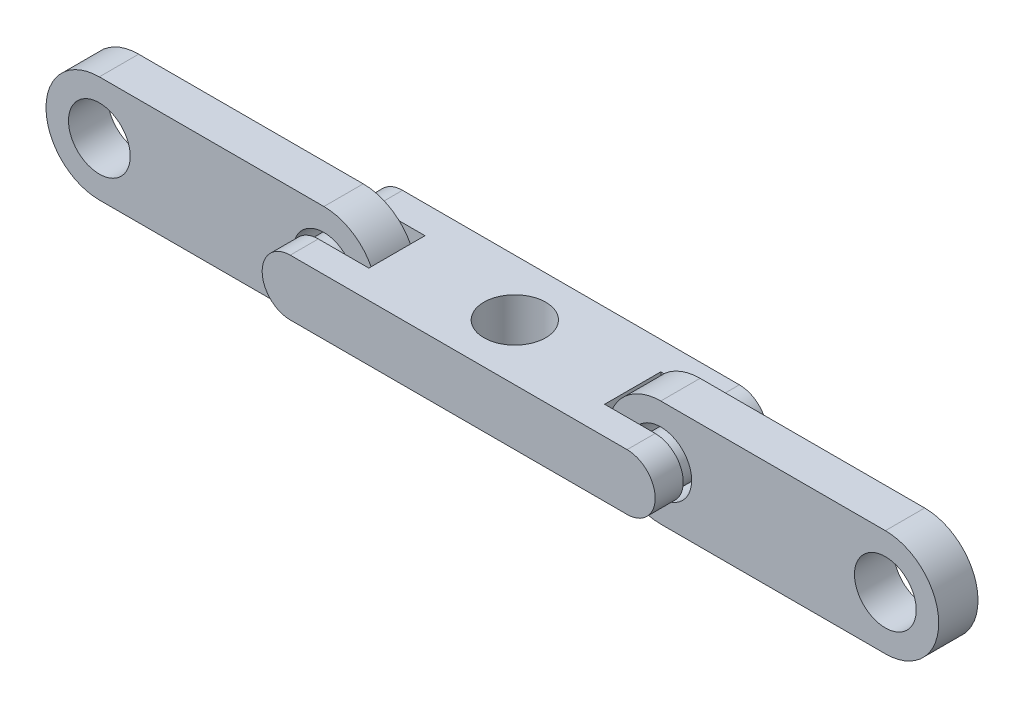
ISO-10303-21;
HEADER;
FILE_DESCRIPTION(('STEP AP214'),'2;1');
FILE_NAME('part.step','',(''),(''),'','','');
FILE_SCHEMA(('AUTOMOTIVE_DESIGN { 1 0 10303 214 1 1 1 1 }'));
ENDSEC;
DATA;
#1=APPLICATION_CONTEXT('core data for automotive mechanical design processes');
#2=APPLICATION_PROTOCOL_DEFINITION('international standard','automotive_design',2000,#1);
#3=PRODUCT_CONTEXT('',#1,'mechanical');
#4=PRODUCT('Part','Part','',(#3));
#5=PRODUCT_RELATED_PRODUCT_CATEGORY('part','',(#4));
#6=PRODUCT_DEFINITION_FORMATION('','',#4);
#7=PRODUCT_DEFINITION_CONTEXT('part definition',#1,'design');
#8=PRODUCT_DEFINITION('design','',#6,#7);
#9=PRODUCT_DEFINITION_SHAPE('','',#8);
#10=(LENGTH_UNIT() NAMED_UNIT(*) SI_UNIT(.MILLI.,.METRE.));
#11=(NAMED_UNIT(*) PLANE_ANGLE_UNIT() SI_UNIT($,.RADIAN.));
#12=(NAMED_UNIT(*) SI_UNIT($,.STERADIAN.) SOLID_ANGLE_UNIT());
#13=UNCERTAINTY_MEASURE_WITH_UNIT(LENGTH_MEASURE(1.E-05),#10,'distance_accuracy_value','');
#14=(GEOMETRIC_REPRESENTATION_CONTEXT(3) GLOBAL_UNCERTAINTY_ASSIGNED_CONTEXT((#13)) GLOBAL_UNIT_ASSIGNED_CONTEXT((#10,
#11,#12)) REPRESENTATION_CONTEXT('',''));
#15=CARTESIAN_POINT('',(0.,0.,0.));
#16=DIRECTION('',(0.,0.,1.));
#17=DIRECTION('',(1.,0.,0.));
#18=AXIS2_PLACEMENT_3D('',#15,#16,#17);
#19=CARTESIAN_POINT('',(15.,0.,5.));
#20=DIRECTION('',(0.,0.,-1.));
#21=DIRECTION('',(-1.,0.,0.));
#22=AXIS2_PLACEMENT_3D('',#19,#20,#21);
#23=CYLINDRICAL_SURFACE('',#22,2.5);
#24=DIRECTION('',(0.,0.,1.));
#25=VECTOR('',#24,1.);
#26=CARTESIAN_POINT('',(15.,2.5,5.));
#27=LINE('',#26,#25);
#28=CARTESIAN_POINT('',(15.,2.5,5.));
#29=VERTEX_POINT('',#28);
#30=CARTESIAN_POINT('',(15.,2.5,2.5));
#31=VERTEX_POINT('',#30);
#32=EDGE_CURVE('P0_E111',#29,#31,#27,.F.);
#33=ORIENTED_EDGE('',*,*,#32,.F.);
#34=CARTESIAN_POINT('',(15.,0.,5.));
#35=DIRECTION('',(0.,0.,-1.));
#36=DIRECTION('',(-1.,0.,0.));
#37=AXIS2_PLACEMENT_3D('',#34,#35,#36);
#38=CIRCLE('',#37,2.5);
#39=CARTESIAN_POINT('',(15.,-2.5,5.));
#40=VERTEX_POINT('',#39);
#41=EDGE_CURVE('P0_E25',#40,#29,#38,.F.);
#42=ORIENTED_EDGE('',*,*,#41,.F.);
#43=DIRECTION('',(0.,0.,-1.));
#44=VECTOR('',#43,1.);
#45=CARTESIAN_POINT('',(15.,-2.5,0.));
#46=LINE('',#45,#44);
#47=CARTESIAN_POINT('',(15.,-2.5,2.5));
#48=VERTEX_POINT('',#47);
#49=EDGE_CURVE('P0_E205',#48,#40,#46,.F.);
#50=ORIENTED_EDGE('',*,*,#49,.F.);
#51=CARTESIAN_POINT('',(15.,0.,2.5));
#52=DIRECTION('',(0.,0.,1.));
#53=DIRECTION('',(1.,0.,0.));
#54=AXIS2_PLACEMENT_3D('',#51,#52,#53);
#55=CIRCLE('',#54,2.5);
#56=EDGE_CURVE('P0_E11',#31,#48,#55,.F.);
#57=ORIENTED_EDGE('',*,*,#56,.F.);
#58=EDGE_LOOP('',(#33,#42,#50,#57));
#59=FACE_BOUND('',#58,.T.);
#60=ADVANCED_FACE('P0_F17',(#59),#23,.T.);
#61=CARTESIAN_POINT('',(15.,0.,-2.5));
#62=DIRECTION('',(0.,0.,-1.));
#63=DIRECTION('',(-1.,0.,0.));
#64=AXIS2_PLACEMENT_3D('',#61,#62,#63);
#65=CYLINDRICAL_SURFACE('',#64,2.5);
#66=DIRECTION('',(0.,0.,1.));
#67=VECTOR('',#66,1.);
#68=CARTESIAN_POINT('',(15.,2.5,-2.5));
#69=LINE('',#68,#67);
#70=CARTESIAN_POINT('',(15.,2.5,-2.5));
#71=VERTEX_POINT('',#70);
#72=CARTESIAN_POINT('',(15.,2.5,-5.));
#73=VERTEX_POINT('',#72);
#74=EDGE_CURVE('P0_E194',#71,#73,#69,.F.);
#75=ORIENTED_EDGE('',*,*,#74,.F.);
#76=CARTESIAN_POINT('',(15.,0.,-2.5));
#77=DIRECTION('',(0.,0.,-1.));
#78=DIRECTION('',(-1.,0.,0.));
#79=AXIS2_PLACEMENT_3D('',#76,#77,#78);
#80=CIRCLE('',#79,2.5);
#81=CARTESIAN_POINT('',(15.,-2.5,-2.5));
#82=VERTEX_POINT('',#81);
#83=EDGE_CURVE('P0_E200',#82,#71,#80,.F.);
#84=ORIENTED_EDGE('',*,*,#83,.F.);
#85=DIRECTION('',(0.,0.,-1.));
#86=VECTOR('',#85,1.);
#87=CARTESIAN_POINT('',(15.,-2.5,0.));
#88=LINE('',#87,#86);
#89=CARTESIAN_POINT('',(15.,-2.5,-5.));
#90=VERTEX_POINT('',#89);
#91=EDGE_CURVE('P0_E197',#90,#82,#88,.F.);
#92=ORIENTED_EDGE('',*,*,#91,.F.);
#93=CARTESIAN_POINT('',(15.,0.,-5.));
#94=DIRECTION('',(0.,0.,1.));
#95=DIRECTION('',(1.,0.,0.));
#96=AXIS2_PLACEMENT_3D('',#93,#94,#95);
#97=CIRCLE('',#96,2.5);
#98=EDGE_CURVE('P0_E202',#73,#90,#97,.F.);
#99=ORIENTED_EDGE('',*,*,#98,.F.);
#100=EDGE_LOOP('',(#75,#84,#92,#99));
#101=FACE_BOUND('',#100,.T.);
#102=ADVANCED_FACE('P0_F246',(#101),#65,.T.);
#103=CARTESIAN_POINT('',(-15.,0.,-5.));
#104=DIRECTION('',(0.,0.,1.));
#105=DIRECTION('',(1.,0.,0.));
#106=AXIS2_PLACEMENT_3D('',#103,#104,#105);
#107=CYLINDRICAL_SURFACE('',#106,2.5);
#108=DIRECTION('',(0.,0.,-1.));
#109=VECTOR('',#108,1.);
#110=CARTESIAN_POINT('',(-15.,2.5,-5.));
#111=LINE('',#110,#109);
#112=CARTESIAN_POINT('',(-15.,2.5,-5.));
#113=VERTEX_POINT('',#112);
#114=CARTESIAN_POINT('',(-15.,2.5,-2.5));
#115=VERTEX_POINT('',#114);
#116=EDGE_CURVE('P0_E183',#113,#115,#111,.F.);
#117=ORIENTED_EDGE('',*,*,#116,.F.);
#118=CARTESIAN_POINT('',(-15.,0.,-5.));
#119=DIRECTION('',(0.,0.,1.));
#120=DIRECTION('',(1.,0.,0.));
#121=AXIS2_PLACEMENT_3D('',#118,#119,#120);
#122=CIRCLE('',#121,2.5);
#123=CARTESIAN_POINT('',(-15.,-2.5,-5.));
#124=VERTEX_POINT('',#123);
#125=EDGE_CURVE('P0_E189',#124,#113,#122,.F.);
#126=ORIENTED_EDGE('',*,*,#125,.F.);
#127=DIRECTION('',(0.,0.,1.));
#128=VECTOR('',#127,1.);
#129=CARTESIAN_POINT('',(-15.,-2.5,0.));
#130=LINE('',#129,#128);
#131=CARTESIAN_POINT('',(-15.,-2.5,-2.5));
#132=VERTEX_POINT('',#131);
#133=EDGE_CURVE('P0_E186',#132,#124,#130,.F.);
#134=ORIENTED_EDGE('',*,*,#133,.F.);
#135=CARTESIAN_POINT('',(-15.,0.,-2.5));
#136=DIRECTION('',(0.,0.,-1.));
#137=DIRECTION('',(-1.,0.,0.));
#138=AXIS2_PLACEMENT_3D('',#135,#136,#137);
#139=CIRCLE('',#138,2.5);
#140=EDGE_CURVE('P0_E192',#115,#132,#139,.F.);
#141=ORIENTED_EDGE('',*,*,#140,.F.);
#142=EDGE_LOOP('',(#117,#126,#134,#141));
#143=FACE_BOUND('',#142,.T.);
#144=ADVANCED_FACE('P0_F233',(#143),#107,.T.);
#145=CARTESIAN_POINT('',(-15.,0.,2.5));
#146=DIRECTION('',(0.,0.,1.));
#147=DIRECTION('',(1.,0.,0.));
#148=AXIS2_PLACEMENT_3D('',#145,#146,#147);
#149=CYLINDRICAL_SURFACE('',#148,2.5);
#150=DIRECTION('',(0.,0.,-1.));
#151=VECTOR('',#150,1.);
#152=CARTESIAN_POINT('',(-15.,2.5,2.5));
#153=LINE('',#152,#151);
#154=CARTESIAN_POINT('',(-15.,2.5,2.5));
#155=VERTEX_POINT('',#154);
#156=CARTESIAN_POINT('',(-15.,2.5,5.));
#157=VERTEX_POINT('',#156);
#158=EDGE_CURVE('P0_E173',#155,#157,#153,.F.);
#159=ORIENTED_EDGE('',*,*,#158,.F.);
#160=CARTESIAN_POINT('',(-15.,0.,2.5));
#161=DIRECTION('',(0.,0.,1.));
#162=DIRECTION('',(1.,0.,0.));
#163=AXIS2_PLACEMENT_3D('',#160,#161,#162);
#164=CIRCLE('',#163,2.5);
#165=CARTESIAN_POINT('',(-15.,-2.5,2.5));
#166=VERTEX_POINT('',#165);
#167=EDGE_CURVE('P0_E179',#166,#155,#164,.F.);
#168=ORIENTED_EDGE('',*,*,#167,.F.);
#169=DIRECTION('',(0.,0.,1.));
#170=VECTOR('',#169,1.);
#171=CARTESIAN_POINT('',(-15.,-2.5,0.));
#172=LINE('',#171,#170);
#173=CARTESIAN_POINT('',(-15.,-2.5,5.));
#174=VERTEX_POINT('',#173);
#175=EDGE_CURVE('P0_E176',#174,#166,#172,.F.);
#176=ORIENTED_EDGE('',*,*,#175,.F.);
#177=CARTESIAN_POINT('',(-15.,0.,5.));
#178=DIRECTION('',(0.,0.,-1.));
#179=DIRECTION('',(-1.,0.,0.));
#180=AXIS2_PLACEMENT_3D('',#177,#178,#179);
#181=CIRCLE('',#180,2.5);
#182=EDGE_CURVE('P0_E181',#157,#174,#181,.F.);
#183=ORIENTED_EDGE('',*,*,#182,.F.);
#184=EDGE_LOOP('',(#159,#168,#176,#183));
#185=FACE_BOUND('',#184,.T.);
#186=ADVANCED_FACE('P0_F213',(#185),#149,.T.);
#187=CARTESIAN_POINT('',(0.,2.5,0.));
#188=DIRECTION('',(0.,1.,0.));
#189=DIRECTION('',(0.,0.,1.));
#190=AXIS2_PLACEMENT_3D('',#187,#188,#189);
#191=PLANE('',#190);
#192=DIRECTION('',(1.,0.,0.));
#193=VECTOR('',#192,1.);
#194=CARTESIAN_POINT('',(-17.5,2.5,5.));
#195=LINE('',#194,#193);
#196=EDGE_CURVE('P0_E141',#157,#29,#195,.T.);
#197=ORIENTED_EDGE('',*,*,#196,.T.);
#198=ORIENTED_EDGE('',*,*,#32,.T.);
#199=DIRECTION('',(-1.,0.,0.));
#200=VECTOR('',#199,1.);
#201=CARTESIAN_POINT('',(10.5,2.5,2.5));
#202=LINE('',#201,#200);
#203=CARTESIAN_POINT('',(10.5,2.5,2.5));
#204=VERTEX_POINT('',#203);
#205=EDGE_CURVE('P0_E102',#31,#204,#202,.T.);
#206=ORIENTED_EDGE('',*,*,#205,.T.);
#207=DIRECTION('',(0.,0.,-1.));
#208=VECTOR('',#207,1.);
#209=CARTESIAN_POINT('',(10.5,2.5,-2.5));
#210=LINE('',#209,#208);
#211=CARTESIAN_POINT('',(10.5,2.5,-2.5));
#212=VERTEX_POINT('',#211);
#213=EDGE_CURVE('P0_E109',#204,#212,#210,.T.);
#214=ORIENTED_EDGE('',*,*,#213,.T.);
#215=DIRECTION('',(1.,0.,0.));
#216=VECTOR('',#215,1.);
#217=CARTESIAN_POINT('',(17.5,2.5,-2.5));
#218=LINE('',#217,#216);
#219=EDGE_CURVE('P0_E127',#212,#71,#218,.T.);
#220=ORIENTED_EDGE('',*,*,#219,.T.);
#221=ORIENTED_EDGE('',*,*,#74,.T.);
#222=DIRECTION('',(-1.,0.,0.));
#223=VECTOR('',#222,1.);
#224=CARTESIAN_POINT('',(-17.5,2.5,-5.));
#225=LINE('',#224,#223);
#226=EDGE_CURVE('P0_E129',#73,#113,#225,.T.);
#227=ORIENTED_EDGE('',*,*,#226,.T.);
#228=ORIENTED_EDGE('',*,*,#116,.T.);
#229=DIRECTION('',(1.,0.,0.));
#230=VECTOR('',#229,1.);
#231=CARTESIAN_POINT('',(-17.5,2.5,-2.5));
#232=LINE('',#231,#230);
#233=CARTESIAN_POINT('',(-10.5,2.5,-2.5));
#234=VERTEX_POINT('',#233);
#235=EDGE_CURVE('P0_E134',#115,#234,#232,.T.);
#236=ORIENTED_EDGE('',*,*,#235,.T.);
#237=DIRECTION('',(0.,0.,1.));
#238=VECTOR('',#237,1.);
#239=CARTESIAN_POINT('',(-10.5,2.5,-2.5));
#240=LINE('',#239,#238);
#241=CARTESIAN_POINT('',(-10.5,2.5,2.5));
#242=VERTEX_POINT('',#241);
#243=EDGE_CURVE('P0_E136',#234,#242,#240,.T.);
#244=ORIENTED_EDGE('',*,*,#243,.T.);
#245=DIRECTION('',(-1.,0.,0.));
#246=VECTOR('',#245,1.);
#247=CARTESIAN_POINT('',(-10.5,2.5,2.5));
#248=LINE('',#247,#246);
#249=EDGE_CURVE('P0_E138',#242,#155,#248,.T.);
#250=ORIENTED_EDGE('',*,*,#249,.T.);
#251=ORIENTED_EDGE('',*,*,#158,.T.);
#252=EDGE_LOOP('',(#197,#198,#206,#214,#220,#221,#227,#228,#236,#244,#250,#251));
#253=FACE_BOUND('',#252,.T.);
#254=CARTESIAN_POINT('',(0.,2.5,0.));
#255=DIRECTION('',(0.,1.,0.));
#256=DIRECTION('',(0.,0.,1.));
#257=AXIS2_PLACEMENT_3D('',#254,#255,#256);
#258=CIRCLE('',#257,2.75);
#259=CARTESIAN_POINT('',(0.,2.5,2.75));
#260=VERTEX_POINT('',#259);
#261=EDGE_CURVE('P0_E146',#260,#260,#258,.T.);
#262=ORIENTED_EDGE('',*,*,#261,.F.);
#263=EDGE_LOOP('',(#262));
#264=FACE_BOUND('',#263,.T.);
#265=ADVANCED_FACE('P0_F105',(#253,#264),#191,.T.);
#266=CARTESIAN_POINT('',(0.,-2.5,0.));
#267=DIRECTION('',(0.,1.,0.));
#268=DIRECTION('',(0.,0.,1.));
#269=AXIS2_PLACEMENT_3D('',#266,#267,#268);
#270=PLANE('',#269);
#271=DIRECTION('',(-1.,0.,0.));
#272=VECTOR('',#271,1.);
#273=CARTESIAN_POINT('',(10.5,-2.5,2.5));
#274=LINE('',#273,#272);
#275=CARTESIAN_POINT('',(10.5,-2.5,2.5));
#276=VERTEX_POINT('',#275);
#277=EDGE_CURVE('P0_E118',#48,#276,#274,.T.);
#278=ORIENTED_EDGE('',*,*,#277,.F.);
#279=ORIENTED_EDGE('',*,*,#49,.T.);
#280=DIRECTION('',(1.,0.,0.));
#281=VECTOR('',#280,1.);
#282=CARTESIAN_POINT('',(-17.5,-2.5,5.));
#283=LINE('',#282,#281);
#284=EDGE_CURVE('P0_E112',#174,#40,#283,.T.);
#285=ORIENTED_EDGE('',*,*,#284,.F.);
#286=ORIENTED_EDGE('',*,*,#175,.T.);
#287=DIRECTION('',(-1.,0.,0.));
#288=VECTOR('',#287,1.);
#289=CARTESIAN_POINT('',(-10.5,-2.5,2.5));
#290=LINE('',#289,#288);
#291=CARTESIAN_POINT('',(-10.5,-2.5,2.5));
#292=VERTEX_POINT('',#291);
#293=EDGE_CURVE('P0_E157',#292,#166,#290,.T.);
#294=ORIENTED_EDGE('',*,*,#293,.F.);
#295=DIRECTION('',(0.,0.,1.));
#296=VECTOR('',#295,1.);
#297=CARTESIAN_POINT('',(-10.5,-2.5,-2.5));
#298=LINE('',#297,#296);
#299=CARTESIAN_POINT('',(-10.5,-2.5,-2.5));
#300=VERTEX_POINT('',#299);
#301=EDGE_CURVE('P0_E155',#300,#292,#298,.T.);
#302=ORIENTED_EDGE('',*,*,#301,.F.);
#303=DIRECTION('',(1.,0.,0.));
#304=VECTOR('',#303,1.);
#305=CARTESIAN_POINT('',(-17.5,-2.5,-2.5));
#306=LINE('',#305,#304);
#307=EDGE_CURVE('P0_E153',#132,#300,#306,.T.);
#308=ORIENTED_EDGE('',*,*,#307,.F.);
#309=ORIENTED_EDGE('',*,*,#133,.T.);
#310=DIRECTION('',(-1.,0.,0.));
#311=VECTOR('',#310,1.);
#312=CARTESIAN_POINT('',(-17.5,-2.5,-5.));
#313=LINE('',#312,#311);
#314=EDGE_CURVE('P0_E151',#90,#124,#313,.T.);
#315=ORIENTED_EDGE('',*,*,#314,.F.);
#316=ORIENTED_EDGE('',*,*,#91,.T.);
#317=DIRECTION('',(1.,0.,0.));
#318=VECTOR('',#317,1.);
#319=CARTESIAN_POINT('',(17.5,-2.5,-2.5));
#320=LINE('',#319,#318);
#321=CARTESIAN_POINT('',(10.5,-2.5,-2.5));
#322=VERTEX_POINT('',#321);
#323=EDGE_CURVE('P0_E148',#322,#82,#320,.T.);
#324=ORIENTED_EDGE('',*,*,#323,.F.);
#325=DIRECTION('',(0.,0.,-1.));
#326=VECTOR('',#325,1.);
#327=CARTESIAN_POINT('',(10.5,-2.5,-2.5));
#328=LINE('',#327,#326);
#329=EDGE_CURVE('P0_E145',#276,#322,#328,.T.);
#330=ORIENTED_EDGE('',*,*,#329,.F.);
#331=EDGE_LOOP('',(#278,#279,#285,#286,#294,#302,#308,#309,#315,#316,#324,#330));
#332=FACE_BOUND('',#331,.T.);
#333=CARTESIAN_POINT('',(0.,-2.5,0.));
#334=DIRECTION('',(0.,1.,0.));
#335=DIRECTION('',(0.,0.,1.));
#336=AXIS2_PLACEMENT_3D('',#333,#334,#335);
#337=CIRCLE('',#336,2.75);
#338=CARTESIAN_POINT('',(0.,-2.5,2.75));
#339=VERTEX_POINT('',#338);
#340=EDGE_CURVE('P0_E311',#339,#339,#337,.T.);
#341=ORIENTED_EDGE('',*,*,#340,.T.);
#342=EDGE_LOOP('',(#341));
#343=FACE_BOUND('',#342,.T.);
#344=ADVANCED_FACE('P0_F217',(#332,#343),#270,.F.);
#345=CARTESIAN_POINT('',(10.5,2.5,2.5));
#346=DIRECTION('',(0.,0.,1.));
#347=DIRECTION('',(1.,0.,0.));
#348=AXIS2_PLACEMENT_3D('',#345,#346,#347);
#349=PLANE('',#348);
#350=CARTESIAN_POINT('',(15.,0.,2.5));
#351=DIRECTION('',(0.,0.,1.));
#352=DIRECTION('',(1.,0.,0.));
#353=AXIS2_PLACEMENT_3D('',#350,#351,#352);
#354=CIRCLE('',#353,2.);
#355=CARTESIAN_POINT('',(17.,0.,2.5));
#356=VERTEX_POINT('',#355);
#357=EDGE_CURVE('P0_E310',#356,#356,#354,.F.);
#358=ORIENTED_EDGE('',*,*,#357,.F.);
#359=EDGE_LOOP('',(#358));
#360=FACE_BOUND('',#359,.T.);
#361=ORIENTED_EDGE('',*,*,#205,.F.);
#362=ORIENTED_EDGE('',*,*,#56,.T.);
#363=ORIENTED_EDGE('',*,*,#277,.T.);
#364=DIRECTION('',(0.,-1.,0.));
#365=VECTOR('',#364,1.);
#366=CARTESIAN_POINT('',(10.5,2.5,2.5));
#367=LINE('',#366,#365);
#368=EDGE_CURVE('P0_E115',#204,#276,#367,.T.);
#369=ORIENTED_EDGE('',*,*,#368,.F.);
#370=EDGE_LOOP('',(#361,#362,#363,#369));
#371=FACE_BOUND('',#370,.T.);
#372=ADVANCED_FACE('P0_F116',(#360,#371),#349,.F.);
#373=CARTESIAN_POINT('',(10.5,2.5,-2.5));
#374=DIRECTION('',(-1.,0.,0.));
#375=DIRECTION('',(0.,0.,1.));
#376=AXIS2_PLACEMENT_3D('',#373,#374,#375);
#377=PLANE('',#376);
#378=ORIENTED_EDGE('',*,*,#329,.T.);
#379=DIRECTION('',(0.,-1.,0.));
#380=VECTOR('',#379,1.);
#381=CARTESIAN_POINT('',(10.5,2.5,-2.5));
#382=LINE('',#381,#380);
#383=EDGE_CURVE('P0_E122',#212,#322,#382,.T.);
#384=ORIENTED_EDGE('',*,*,#383,.F.);
#385=ORIENTED_EDGE('',*,*,#213,.F.);
#386=ORIENTED_EDGE('',*,*,#368,.T.);
#387=EDGE_LOOP('',(#378,#384,#385,#386));
#388=FACE_BOUND('',#387,.T.);
#389=ADVANCED_FACE('P0_F124',(#388),#377,.F.);
#390=CARTESIAN_POINT('',(17.5,2.5,-2.5));
#391=DIRECTION('',(0.,0.,-1.));
#392=DIRECTION('',(-1.,0.,0.));
#393=AXIS2_PLACEMENT_3D('',#390,#391,#392);
#394=PLANE('',#393);
#395=CARTESIAN_POINT('',(15.,0.,-2.5));
#396=DIRECTION('',(0.,0.,-1.));
#397=DIRECTION('',(-1.,0.,0.));
#398=AXIS2_PLACEMENT_3D('',#395,#396,#397);
#399=CIRCLE('',#398,2.);
#400=CARTESIAN_POINT('',(13.,0.,-2.5));
#401=VERTEX_POINT('',#400);
#402=EDGE_CURVE('P0_E307',#401,#401,#399,.T.);
#403=ORIENTED_EDGE('',*,*,#402,.T.);
#404=EDGE_LOOP('',(#403));
#405=FACE_BOUND('',#404,.T.);
#406=ORIENTED_EDGE('',*,*,#323,.T.);
#407=ORIENTED_EDGE('',*,*,#83,.T.);
#408=ORIENTED_EDGE('',*,*,#219,.F.);
#409=ORIENTED_EDGE('',*,*,#383,.T.);
#410=EDGE_LOOP('',(#406,#407,#408,#409));
#411=FACE_BOUND('',#410,.T.);
#412=ADVANCED_FACE('P0_F221',(#405,#411),#394,.F.);
#413=CARTESIAN_POINT('',(-17.5,2.5,-5.));
#414=DIRECTION('',(0.,0.,1.));
#415=DIRECTION('',(1.,0.,0.));
#416=AXIS2_PLACEMENT_3D('',#413,#414,#415);
#417=PLANE('',#416);
#418=ORIENTED_EDGE('',*,*,#226,.F.);
#419=ORIENTED_EDGE('',*,*,#98,.T.);
#420=ORIENTED_EDGE('',*,*,#314,.T.);
#421=ORIENTED_EDGE('',*,*,#125,.T.);
#422=EDGE_LOOP('',(#418,#419,#420,#421));
#423=FACE_BOUND('',#422,.T.);
#424=ADVANCED_FACE('P0_F226',(#423),#417,.F.);
#425=CARTESIAN_POINT('',(-17.5,2.5,-2.5));
#426=DIRECTION('',(0.,0.,-1.));
#427=DIRECTION('',(-1.,0.,0.));
#428=AXIS2_PLACEMENT_3D('',#425,#426,#427);
#429=PLANE('',#428);
#430=CARTESIAN_POINT('',(-15.,0.,-2.5));
#431=DIRECTION('',(0.,0.,-1.));
#432=DIRECTION('',(-1.,0.,0.));
#433=AXIS2_PLACEMENT_3D('',#430,#431,#432);
#434=CIRCLE('',#433,2.);
#435=CARTESIAN_POINT('',(-17.,0.,-2.5));
#436=VERTEX_POINT('',#435);
#437=EDGE_CURVE('P0_E170',#436,#436,#434,.F.);
#438=ORIENTED_EDGE('',*,*,#437,.F.);
#439=EDGE_LOOP('',(#438));
#440=FACE_BOUND('',#439,.T.);
#441=ORIENTED_EDGE('',*,*,#235,.F.);
#442=ORIENTED_EDGE('',*,*,#140,.T.);
#443=ORIENTED_EDGE('',*,*,#307,.T.);
#444=DIRECTION('',(0.,-1.,0.));
#445=VECTOR('',#444,1.);
#446=CARTESIAN_POINT('',(-10.5,2.5,-2.5));
#447=LINE('',#446,#445);
#448=EDGE_CURVE('P0_E164',#234,#300,#447,.T.);
#449=ORIENTED_EDGE('',*,*,#448,.F.);
#450=EDGE_LOOP('',(#441,#442,#443,#449));
#451=FACE_BOUND('',#450,.T.);
#452=ADVANCED_FACE('P0_F237',(#440,#451),#429,.F.);
#453=CARTESIAN_POINT('',(-10.5,2.5,-2.5));
#454=DIRECTION('',(1.,0.,0.));
#455=DIRECTION('',(0.,0.,-1.));
#456=AXIS2_PLACEMENT_3D('',#453,#454,#455);
#457=PLANE('',#456);
#458=ORIENTED_EDGE('',*,*,#301,.T.);
#459=DIRECTION('',(0.,-1.,0.));
#460=VECTOR('',#459,1.);
#461=CARTESIAN_POINT('',(-10.5,2.5,2.5));
#462=LINE('',#461,#460);
#463=EDGE_CURVE('P0_E143',#242,#292,#462,.T.);
#464=ORIENTED_EDGE('',*,*,#463,.F.);
#465=ORIENTED_EDGE('',*,*,#243,.F.);
#466=ORIENTED_EDGE('',*,*,#448,.T.);
#467=EDGE_LOOP('',(#458,#464,#465,#466));
#468=FACE_BOUND('',#467,.T.);
#469=ADVANCED_FACE('P0_F243',(#468),#457,.F.);
#470=CARTESIAN_POINT('',(-10.5,2.5,2.5));
#471=DIRECTION('',(0.,0.,1.));
#472=DIRECTION('',(1.,0.,0.));
#473=AXIS2_PLACEMENT_3D('',#470,#471,#472);
#474=PLANE('',#473);
#475=CARTESIAN_POINT('',(-15.,0.,2.5));
#476=DIRECTION('',(0.,0.,1.));
#477=DIRECTION('',(1.,0.,0.));
#478=AXIS2_PLACEMENT_3D('',#475,#476,#477);
#479=CIRCLE('',#478,2.);
#480=CARTESIAN_POINT('',(-13.,0.,2.5));
#481=VERTEX_POINT('',#480);
#482=EDGE_CURVE('P0_E121',#481,#481,#479,.F.);
#483=ORIENTED_EDGE('',*,*,#482,.F.);
#484=EDGE_LOOP('',(#483));
#485=FACE_BOUND('',#484,.T.);
#486=ORIENTED_EDGE('',*,*,#293,.T.);
#487=ORIENTED_EDGE('',*,*,#167,.T.);
#488=ORIENTED_EDGE('',*,*,#249,.F.);
#489=ORIENTED_EDGE('',*,*,#463,.T.);
#490=EDGE_LOOP('',(#486,#487,#488,#489));
#491=FACE_BOUND('',#490,.T.);
#492=ADVANCED_FACE('P0_F245',(#485,#491),#474,.F.);
#493=CARTESIAN_POINT('',(-17.5,2.5,5.));
#494=DIRECTION('',(0.,0.,-1.));
#495=DIRECTION('',(-1.,0.,0.));
#496=AXIS2_PLACEMENT_3D('',#493,#494,#495);
#497=PLANE('',#496);
#498=ORIENTED_EDGE('',*,*,#284,.T.);
#499=ORIENTED_EDGE('',*,*,#41,.T.);
#500=ORIENTED_EDGE('',*,*,#196,.F.);
#501=ORIENTED_EDGE('',*,*,#182,.T.);
#502=EDGE_LOOP('',(#498,#499,#500,#501));
#503=FACE_BOUND('',#502,.T.);
#504=ADVANCED_FACE('P0_F208',(#503),#497,.F.);
#505=CARTESIAN_POINT('',(0.,2.5,0.));
#506=DIRECTION('',(0.,-1.,0.));
#507=DIRECTION('',(0.,0.,-1.));
#508=AXIS2_PLACEMENT_3D('',#505,#506,#507);
#509=CYLINDRICAL_SURFACE('',#508,2.75);
#510=ORIENTED_EDGE('',*,*,#261,.T.);
#511=EDGE_LOOP('',(#510));
#512=FACE_BOUND('',#511,.T.);
#513=ORIENTED_EDGE('',*,*,#340,.F.);
#514=EDGE_LOOP('',(#513));
#515=FACE_BOUND('',#514,.T.);
#516=ADVANCED_FACE('P0_F287',(#512,#515),#509,.F.);
#517=CARTESIAN_POINT('',(-15.,0.,8.15685424949238));
#518=DIRECTION('',(0.,0.,-1.));
#519=DIRECTION('',(-1.,0.,0.));
#520=AXIS2_PLACEMENT_3D('',#517,#518,#519);
#521=CYLINDRICAL_SURFACE('',#520,2.);
#522=ORIENTED_EDGE('',*,*,#437,.T.);
#523=EDGE_LOOP('',(#522));
#524=FACE_BOUND('',#523,.T.);
#525=ORIENTED_EDGE('',*,*,#482,.T.);
#526=EDGE_LOOP('',(#525));
#527=FACE_BOUND('',#526,.T.);
#528=ADVANCED_FACE('P0_F294',(#524,#527),#521,.T.);
#529=CARTESIAN_POINT('',(15.,0.,8.15685424949238));
#530=DIRECTION('',(0.,0.,-1.));
#531=DIRECTION('',(-1.,0.,0.));
#532=AXIS2_PLACEMENT_3D('',#529,#530,#531);
#533=CYLINDRICAL_SURFACE('',#532,2.);
#534=ORIENTED_EDGE('',*,*,#402,.F.);
#535=EDGE_LOOP('',(#534));
#536=FACE_BOUND('',#535,.T.);
#537=ORIENTED_EDGE('',*,*,#357,.T.);
#538=EDGE_LOOP('',(#537));
#539=FACE_BOUND('',#538,.T.);
#540=ADVANCED_FACE('P0_F298',(#536,#539),#533,.T.);
#541=CLOSED_SHELL('',(#60,#102,#144,#186,#265,#344,#372,#389,#412,#424,#452,#469,#492,#504,#516,
#528,#540));
#542=MANIFOLD_SOLID_BREP('P0_B1',#541);
#543=CARTESIAN_POINT('',(-35.,0.,2.));
#544=DIRECTION('',(0.,0.,1.));
#545=DIRECTION('',(1.,0.,0.));
#546=AXIS2_PLACEMENT_3D('',#543,#544,#545);
#547=PLANE('',#546);
#548=CARTESIAN_POINT('',(-35.,0.,2.));
#549=DIRECTION('',(0.,0.,1.));
#550=DIRECTION('',(1.,0.,0.));
#551=AXIS2_PLACEMENT_3D('',#548,#549,#550);
#552=CIRCLE('',#551,2.75);
#553=CARTESIAN_POINT('',(-32.25,0.,2.));
#554=VERTEX_POINT('',#553);
#555=EDGE_CURVE('P1_E84',#554,#554,#552,.T.);
#556=ORIENTED_EDGE('',*,*,#555,.F.);
#557=EDGE_LOOP('',(#556));
#558=FACE_BOUND('',#557,.T.);
#559=CARTESIAN_POINT('',(-35.,0.,2.));
#560=DIRECTION('',(0.,0.,1.));
#561=DIRECTION('',(1.,0.,0.));
#562=AXIS2_PLACEMENT_3D('',#559,#560,#561);
#563=CIRCLE('',#562,4.75);
#564=CARTESIAN_POINT('',(-35.,4.75,2.));
#565=VERTEX_POINT('',#564);
#566=CARTESIAN_POINT('',(-35.,-4.75,2.));
#567=VERTEX_POINT('',#566);
#568=EDGE_CURVE('P1_E69',#565,#567,#563,.T.);
#569=ORIENTED_EDGE('',*,*,#568,.T.);
#570=DIRECTION('',(1.,0.,0.));
#571=VECTOR('',#570,1.);
#572=CARTESIAN_POINT('',(-35.,-4.75,2.));
#573=LINE('',#572,#571);
#574=CARTESIAN_POINT('',(-15.,-4.75,2.));
#575=VERTEX_POINT('',#574);
#576=EDGE_CURVE('P1_E64',#567,#575,#573,.T.);
#577=ORIENTED_EDGE('',*,*,#576,.T.);
#578=CARTESIAN_POINT('',(-15.,0.,2.));
#579=DIRECTION('',(0.,0.,1.));
#580=DIRECTION('',(1.,0.,0.));
#581=AXIS2_PLACEMENT_3D('',#578,#579,#580);
#582=CIRCLE('',#581,4.75);
#583=CARTESIAN_POINT('',(-15.,4.75,2.));
#584=VERTEX_POINT('',#583);
#585=EDGE_CURVE('P1_E67',#575,#584,#582,.T.);
#586=ORIENTED_EDGE('',*,*,#585,.T.);
#587=DIRECTION('',(-1.,0.,0.));
#588=VECTOR('',#587,1.);
#589=CARTESIAN_POINT('',(-35.,4.75,2.));
#590=LINE('',#589,#588);
#591=EDGE_CURVE('P1_E34',#584,#565,#590,.T.);
#592=ORIENTED_EDGE('',*,*,#591,.T.);
#593=EDGE_LOOP('',(#569,#577,#586,#592));
#594=FACE_BOUND('',#593,.T.);
#595=CARTESIAN_POINT('',(-15.,0.,2.));
#596=DIRECTION('',(0.,0.,1.));
#597=DIRECTION('',(1.,0.,0.));
#598=AXIS2_PLACEMENT_3D('',#595,#596,#597);
#599=CIRCLE('',#598,2.75);
#600=CARTESIAN_POINT('',(-12.25,0.,2.));
#601=VERTEX_POINT('',#600);
#602=EDGE_CURVE('P1_E99',#601,#601,#599,.T.);
#603=ORIENTED_EDGE('',*,*,#602,.F.);
#604=EDGE_LOOP('',(#603));
#605=FACE_BOUND('',#604,.T.);
#606=ADVANCED_FACE('P1_F17',(#558,#594,#605),#547,.T.);
#607=CARTESIAN_POINT('',(-35.,0.,-1.5));
#608=DIRECTION('',(0.,0.,1.));
#609=DIRECTION('',(1.,0.,0.));
#610=AXIS2_PLACEMENT_3D('',#607,#608,#609);
#611=PLANE('',#610);
#612=CARTESIAN_POINT('',(-35.,0.,-1.5));
#613=DIRECTION('',(0.,0.,1.));
#614=DIRECTION('',(1.,0.,0.));
#615=AXIS2_PLACEMENT_3D('',#612,#613,#614);
#616=CIRCLE('',#615,4.75);
#617=CARTESIAN_POINT('',(-35.,4.75,-1.5));
#618=VERTEX_POINT('',#617);
#619=CARTESIAN_POINT('',(-35.,-4.75,-1.5));
#620=VERTEX_POINT('',#619);
#621=EDGE_CURVE('P1_E81',#618,#620,#616,.T.);
#622=ORIENTED_EDGE('',*,*,#621,.F.);
#623=DIRECTION('',(-1.,0.,0.));
#624=VECTOR('',#623,1.);
#625=CARTESIAN_POINT('',(-35.,4.75,-1.5));
#626=LINE('',#625,#624);
#627=CARTESIAN_POINT('',(-15.,4.75,-1.5));
#628=VERTEX_POINT('',#627);
#629=EDGE_CURVE('P1_E57',#628,#618,#626,.T.);
#630=ORIENTED_EDGE('',*,*,#629,.F.);
#631=CARTESIAN_POINT('',(-15.,0.,-1.5));
#632=DIRECTION('',(0.,0.,1.));
#633=DIRECTION('',(1.,0.,0.));
#634=AXIS2_PLACEMENT_3D('',#631,#632,#633);
#635=CIRCLE('',#634,4.75);
#636=CARTESIAN_POINT('',(-15.,-4.75,-1.5));
#637=VERTEX_POINT('',#636);
#638=EDGE_CURVE('P1_E51',#637,#628,#635,.T.);
#639=ORIENTED_EDGE('',*,*,#638,.F.);
#640=DIRECTION('',(1.,0.,0.));
#641=VECTOR('',#640,1.);
#642=CARTESIAN_POINT('',(-35.,-4.75,-1.5));
#643=LINE('',#642,#641);
#644=EDGE_CURVE('P1_E73',#620,#637,#643,.T.);
#645=ORIENTED_EDGE('',*,*,#644,.F.);
#646=EDGE_LOOP('',(#622,#630,#639,#645));
#647=FACE_BOUND('',#646,.T.);
#648=CARTESIAN_POINT('',(-35.,0.,-1.5));
#649=DIRECTION('',(0.,0.,1.));
#650=DIRECTION('',(1.,0.,0.));
#651=AXIS2_PLACEMENT_3D('',#648,#649,#650);
#652=CIRCLE('',#651,2.75);
#653=CARTESIAN_POINT('',(-32.25,0.,-1.5));
#654=VERTEX_POINT('',#653);
#655=EDGE_CURVE('P1_E96',#654,#654,#652,.T.);
#656=ORIENTED_EDGE('',*,*,#655,.T.);
#657=EDGE_LOOP('',(#656));
#658=FACE_BOUND('',#657,.T.);
#659=CARTESIAN_POINT('',(-15.,0.,-1.5));
#660=DIRECTION('',(0.,0.,1.));
#661=DIRECTION('',(1.,0.,0.));
#662=AXIS2_PLACEMENT_3D('',#659,#660,#661);
#663=CIRCLE('',#662,2.75);
#664=CARTESIAN_POINT('',(-12.25,0.,-1.5));
#665=VERTEX_POINT('',#664);
#666=EDGE_CURVE('P1_E102',#665,#665,#663,.T.);
#667=ORIENTED_EDGE('',*,*,#666,.T.);
#668=EDGE_LOOP('',(#667));
#669=FACE_BOUND('',#668,.T.);
#670=ADVANCED_FACE('P1_F92',(#647,#658,#669),#611,.F.);
#671=CARTESIAN_POINT('',(-35.,0.,2.));
#672=DIRECTION('',(0.,0.,-1.));
#673=DIRECTION('',(-1.,0.,0.));
#674=AXIS2_PLACEMENT_3D('',#671,#672,#673);
#675=CYLINDRICAL_SURFACE('',#674,4.75);
#676=ORIENTED_EDGE('',*,*,#621,.T.);
#677=DIRECTION('',(0.,0.,-1.));
#678=VECTOR('',#677,1.);
#679=CARTESIAN_POINT('',(-35.,-4.75,2.));
#680=LINE('',#679,#678);
#681=EDGE_CURVE('P1_E11',#567,#620,#680,.T.);
#682=ORIENTED_EDGE('',*,*,#681,.F.);
#683=ORIENTED_EDGE('',*,*,#568,.F.);
#684=DIRECTION('',(0.,0.,-1.));
#685=VECTOR('',#684,1.);
#686=CARTESIAN_POINT('',(-35.,4.75,2.));
#687=LINE('',#686,#685);
#688=EDGE_CURVE('P1_E77',#565,#618,#687,.T.);
#689=ORIENTED_EDGE('',*,*,#688,.T.);
#690=EDGE_LOOP('',(#676,#682,#683,#689));
#691=FACE_BOUND('',#690,.T.);
#692=ADVANCED_FACE('P1_F19',(#691),#675,.T.);
#693=CARTESIAN_POINT('',(-35.,-4.75,2.));
#694=DIRECTION('',(0.,1.,0.));
#695=DIRECTION('',(0.,0.,1.));
#696=AXIS2_PLACEMENT_3D('',#693,#694,#695);
#697=PLANE('',#696);
#698=ORIENTED_EDGE('',*,*,#644,.T.);
#699=DIRECTION('',(0.,0.,-1.));
#700=VECTOR('',#699,1.);
#701=CARTESIAN_POINT('',(-15.,-4.75,2.));
#702=LINE('',#701,#700);
#703=EDGE_CURVE('P1_E26',#575,#637,#702,.T.);
#704=ORIENTED_EDGE('',*,*,#703,.F.);
#705=ORIENTED_EDGE('',*,*,#576,.F.);
#706=ORIENTED_EDGE('',*,*,#681,.T.);
#707=EDGE_LOOP('',(#698,#704,#705,#706));
#708=FACE_BOUND('',#707,.T.);
#709=ADVANCED_FACE('P1_F72',(#708),#697,.F.);
#710=CARTESIAN_POINT('',(-15.,0.,2.));
#711=DIRECTION('',(0.,0.,-1.));
#712=DIRECTION('',(-1.,0.,0.));
#713=AXIS2_PLACEMENT_3D('',#710,#711,#712);
#714=CYLINDRICAL_SURFACE('',#713,4.75);
#715=ORIENTED_EDGE('',*,*,#638,.T.);
#716=DIRECTION('',(0.,0.,-1.));
#717=VECTOR('',#716,1.);
#718=CARTESIAN_POINT('',(-15.,4.75,2.));
#719=LINE('',#718,#717);
#720=EDGE_CURVE('P1_E74',#584,#628,#719,.T.);
#721=ORIENTED_EDGE('',*,*,#720,.F.);
#722=ORIENTED_EDGE('',*,*,#585,.F.);
#723=ORIENTED_EDGE('',*,*,#703,.T.);
#724=EDGE_LOOP('',(#715,#721,#722,#723));
#725=FACE_BOUND('',#724,.T.);
#726=ADVANCED_FACE('P1_F75',(#725),#714,.T.);
#727=CARTESIAN_POINT('',(-35.,4.75,2.));
#728=DIRECTION('',(0.,-1.,0.));
#729=DIRECTION('',(1.,0.,0.));
#730=AXIS2_PLACEMENT_3D('',#727,#728,#729);
#731=PLANE('',#730);
#732=ORIENTED_EDGE('',*,*,#629,.T.);
#733=ORIENTED_EDGE('',*,*,#688,.F.);
#734=ORIENTED_EDGE('',*,*,#591,.F.);
#735=ORIENTED_EDGE('',*,*,#720,.T.);
#736=EDGE_LOOP('',(#732,#733,#734,#735));
#737=FACE_BOUND('',#736,.T.);
#738=ADVANCED_FACE('P1_F89',(#737),#731,.F.);
#739=CARTESIAN_POINT('',(-35.,0.,2.));
#740=DIRECTION('',(0.,0.,-1.));
#741=DIRECTION('',(-1.,0.,0.));
#742=AXIS2_PLACEMENT_3D('',#739,#740,#741);
#743=CYLINDRICAL_SURFACE('',#742,2.75);
#744=ORIENTED_EDGE('',*,*,#555,.T.);
#745=EDGE_LOOP('',(#744));
#746=FACE_BOUND('',#745,.T.);
#747=ORIENTED_EDGE('',*,*,#655,.F.);
#748=EDGE_LOOP('',(#747));
#749=FACE_BOUND('',#748,.T.);
#750=ADVANCED_FACE('P1_F120',(#746,#749),#743,.F.);
#751=CARTESIAN_POINT('',(-15.,0.,2.));
#752=DIRECTION('',(0.,0.,-1.));
#753=DIRECTION('',(-1.,0.,0.));
#754=AXIS2_PLACEMENT_3D('',#751,#752,#753);
#755=CYLINDRICAL_SURFACE('',#754,2.75);
#756=ORIENTED_EDGE('',*,*,#602,.T.);
#757=EDGE_LOOP('',(#756));
#758=FACE_BOUND('',#757,.T.);
#759=ORIENTED_EDGE('',*,*,#666,.F.);
#760=EDGE_LOOP('',(#759));
#761=FACE_BOUND('',#760,.T.);
#762=ADVANCED_FACE('P1_F108',(#758,#761),#755,.F.);
#763=CLOSED_SHELL('',(#606,#670,#692,#709,#726,#738,#750,#762));
#764=MANIFOLD_SOLID_BREP('P1_B1',#763);
#765=CARTESIAN_POINT('',(35.,0.,-1.5));
#766=DIRECTION('',(0.,0.,-1.));
#767=DIRECTION('',(-1.,0.,0.));
#768=AXIS2_PLACEMENT_3D('',#765,#766,#767);
#769=PLANE('',#768);
#770=CARTESIAN_POINT('',(35.,0.,-1.5));
#771=DIRECTION('',(0.,0.,-1.));
#772=DIRECTION('',(-1.,0.,0.));
#773=AXIS2_PLACEMENT_3D('',#770,#771,#772);
#774=CIRCLE('',#773,2.75);
#775=CARTESIAN_POINT('',(32.25,0.,-1.5));
#776=VERTEX_POINT('',#775);
#777=EDGE_CURVE('P2_E83',#776,#776,#774,.T.);
#778=ORIENTED_EDGE('',*,*,#777,.F.);
#779=EDGE_LOOP('',(#778));
#780=FACE_BOUND('',#779,.T.);
#781=CARTESIAN_POINT('',(35.,0.,-1.5));
#782=DIRECTION('',(0.,0.,-1.));
#783=DIRECTION('',(-1.,0.,0.));
#784=AXIS2_PLACEMENT_3D('',#781,#782,#783);
#785=CIRCLE('',#784,4.75);
#786=CARTESIAN_POINT('',(35.,4.75,-1.5));
#787=VERTEX_POINT('',#786);
#788=CARTESIAN_POINT('',(35.,-4.75,-1.5));
#789=VERTEX_POINT('',#788);
#790=EDGE_CURVE('P2_E68',#787,#789,#785,.T.);
#791=ORIENTED_EDGE('',*,*,#790,.T.);
#792=DIRECTION('',(-1.,0.,0.));
#793=VECTOR('',#792,1.);
#794=CARTESIAN_POINT('',(35.,-4.75,-1.5));
#795=LINE('',#794,#793);
#796=CARTESIAN_POINT('',(15.,-4.75,-1.5));
#797=VERTEX_POINT('',#796);
#798=EDGE_CURVE('P2_E63',#789,#797,#795,.T.);
#799=ORIENTED_EDGE('',*,*,#798,.T.);
#800=CARTESIAN_POINT('',(15.,0.,-1.5));
#801=DIRECTION('',(0.,0.,-1.));
#802=DIRECTION('',(-1.,0.,0.));
#803=AXIS2_PLACEMENT_3D('',#800,#801,#802);
#804=CIRCLE('',#803,4.75);
#805=CARTESIAN_POINT('',(15.,4.75,-1.5));
#806=VERTEX_POINT('',#805);
#807=EDGE_CURVE('P2_E66',#797,#806,#804,.T.);
#808=ORIENTED_EDGE('',*,*,#807,.T.);
#809=DIRECTION('',(1.,0.,0.));
#810=VECTOR('',#809,1.);
#811=CARTESIAN_POINT('',(35.,4.75,-1.5));
#812=LINE('',#811,#810);
#813=EDGE_CURVE('P2_E33',#806,#787,#812,.T.);
#814=ORIENTED_EDGE('',*,*,#813,.T.);
#815=EDGE_LOOP('',(#791,#799,#808,#814));
#816=FACE_BOUND('',#815,.T.);
#817=CARTESIAN_POINT('',(15.,0.,-1.5));
#818=DIRECTION('',(0.,0.,-1.));
#819=DIRECTION('',(-1.,0.,0.));
#820=AXIS2_PLACEMENT_3D('',#817,#818,#819);
#821=CIRCLE('',#820,2.75);
#822=CARTESIAN_POINT('',(12.25,0.,-1.5));
#823=VERTEX_POINT('',#822);
#824=EDGE_CURVE('P2_E98',#823,#823,#821,.T.);
#825=ORIENTED_EDGE('',*,*,#824,.F.);
#826=EDGE_LOOP('',(#825));
#827=FACE_BOUND('',#826,.T.);
#828=ADVANCED_FACE('P2_F16',(#780,#816,#827),#769,.T.);
#829=CARTESIAN_POINT('',(35.,0.,2.));
#830=DIRECTION('',(0.,0.,-1.));
#831=DIRECTION('',(-1.,0.,0.));
#832=AXIS2_PLACEMENT_3D('',#829,#830,#831);
#833=PLANE('',#832);
#834=CARTESIAN_POINT('',(35.,0.,2.));
#835=DIRECTION('',(0.,0.,-1.));
#836=DIRECTION('',(-1.,0.,0.));
#837=AXIS2_PLACEMENT_3D('',#834,#835,#836);
#838=CIRCLE('',#837,4.75);
#839=CARTESIAN_POINT('',(35.,4.75,2.));
#840=VERTEX_POINT('',#839);
#841=CARTESIAN_POINT('',(35.,-4.75,2.));
#842=VERTEX_POINT('',#841);
#843=EDGE_CURVE('P2_E80',#840,#842,#838,.T.);
#844=ORIENTED_EDGE('',*,*,#843,.F.);
#845=DIRECTION('',(1.,0.,0.));
#846=VECTOR('',#845,1.);
#847=CARTESIAN_POINT('',(35.,4.75,2.));
#848=LINE('',#847,#846);
#849=CARTESIAN_POINT('',(15.,4.75,2.));
#850=VERTEX_POINT('',#849);
#851=EDGE_CURVE('P2_E56',#850,#840,#848,.T.);
#852=ORIENTED_EDGE('',*,*,#851,.F.);
#853=CARTESIAN_POINT('',(15.,0.,2.));
#854=DIRECTION('',(0.,0.,-1.));
#855=DIRECTION('',(-1.,0.,0.));
#856=AXIS2_PLACEMENT_3D('',#853,#854,#855);
#857=CIRCLE('',#856,4.75);
#858=CARTESIAN_POINT('',(15.,-4.75,2.));
#859=VERTEX_POINT('',#858);
#860=EDGE_CURVE('P2_E50',#859,#850,#857,.T.);
#861=ORIENTED_EDGE('',*,*,#860,.F.);
#862=DIRECTION('',(-1.,0.,0.));
#863=VECTOR('',#862,1.);
#864=CARTESIAN_POINT('',(35.,-4.75,2.));
#865=LINE('',#864,#863);
#866=EDGE_CURVE('P2_E72',#842,#859,#865,.T.);
#867=ORIENTED_EDGE('',*,*,#866,.F.);
#868=EDGE_LOOP('',(#844,#852,#861,#867));
#869=FACE_BOUND('',#868,.T.);
#870=CARTESIAN_POINT('',(35.,0.,2.));
#871=DIRECTION('',(0.,0.,-1.));
#872=DIRECTION('',(-1.,0.,0.));
#873=AXIS2_PLACEMENT_3D('',#870,#871,#872);
#874=CIRCLE('',#873,2.75);
#875=CARTESIAN_POINT('',(32.25,0.,2.));
#876=VERTEX_POINT('',#875);
#877=EDGE_CURVE('P2_E95',#876,#876,#874,.T.);
#878=ORIENTED_EDGE('',*,*,#877,.T.);
#879=EDGE_LOOP('',(#878));
#880=FACE_BOUND('',#879,.T.);
#881=CARTESIAN_POINT('',(15.,0.,2.));
#882=DIRECTION('',(0.,0.,-1.));
#883=DIRECTION('',(-1.,0.,0.));
#884=AXIS2_PLACEMENT_3D('',#881,#882,#883);
#885=CIRCLE('',#884,2.75);
#886=CARTESIAN_POINT('',(12.25,0.,2.));
#887=VERTEX_POINT('',#886);
#888=EDGE_CURVE('P2_E101',#887,#887,#885,.T.);
#889=ORIENTED_EDGE('',*,*,#888,.T.);
#890=EDGE_LOOP('',(#889));
#891=FACE_BOUND('',#890,.T.);
#892=ADVANCED_FACE('P2_F91',(#869,#880,#891),#833,.F.);
#893=CARTESIAN_POINT('',(35.,0.,-1.5));
#894=DIRECTION('',(0.,0.,1.));
#895=DIRECTION('',(1.,0.,0.));
#896=AXIS2_PLACEMENT_3D('',#893,#894,#895);
#897=CYLINDRICAL_SURFACE('',#896,4.75);
#898=ORIENTED_EDGE('',*,*,#843,.T.);
#899=DIRECTION('',(0.,0.,1.));
#900=VECTOR('',#899,1.);
#901=CARTESIAN_POINT('',(35.,-4.75,-1.5));
#902=LINE('',#901,#900);
#903=EDGE_CURVE('P2_E10',#789,#842,#902,.T.);
#904=ORIENTED_EDGE('',*,*,#903,.F.);
#905=ORIENTED_EDGE('',*,*,#790,.F.);
#906=DIRECTION('',(0.,0.,1.));
#907=VECTOR('',#906,1.);
#908=CARTESIAN_POINT('',(35.,4.75,-1.5));
#909=LINE('',#908,#907);
#910=EDGE_CURVE('P2_E76',#787,#840,#909,.T.);
#911=ORIENTED_EDGE('',*,*,#910,.T.);
#912=EDGE_LOOP('',(#898,#904,#905,#911));
#913=FACE_BOUND('',#912,.T.);
#914=ADVANCED_FACE('P2_F18',(#913),#897,.T.);
#915=CARTESIAN_POINT('',(35.,-4.75,-1.5));
#916=DIRECTION('',(0.,1.,0.));
#917=DIRECTION('',(0.,0.,-1.));
#918=AXIS2_PLACEMENT_3D('',#915,#916,#917);
#919=PLANE('',#918);
#920=ORIENTED_EDGE('',*,*,#866,.T.);
#921=DIRECTION('',(0.,0.,1.));
#922=VECTOR('',#921,1.);
#923=CARTESIAN_POINT('',(15.,-4.75,-1.5));
#924=LINE('',#923,#922);
#925=EDGE_CURVE('P2_E25',#797,#859,#924,.T.);
#926=ORIENTED_EDGE('',*,*,#925,.F.);
#927=ORIENTED_EDGE('',*,*,#798,.F.);
#928=ORIENTED_EDGE('',*,*,#903,.T.);
#929=EDGE_LOOP('',(#920,#926,#927,#928));
#930=FACE_BOUND('',#929,.T.);
#931=ADVANCED_FACE('P2_F71',(#930),#919,.F.);
#932=CARTESIAN_POINT('',(15.,0.,-1.5));
#933=DIRECTION('',(0.,0.,1.));
#934=DIRECTION('',(1.,0.,0.));
#935=AXIS2_PLACEMENT_3D('',#932,#933,#934);
#936=CYLINDRICAL_SURFACE('',#935,4.75);
#937=ORIENTED_EDGE('',*,*,#860,.T.);
#938=DIRECTION('',(0.,0.,1.));
#939=VECTOR('',#938,1.);
#940=CARTESIAN_POINT('',(15.,4.75,-1.5));
#941=LINE('',#940,#939);
#942=EDGE_CURVE('P2_E73',#806,#850,#941,.T.);
#943=ORIENTED_EDGE('',*,*,#942,.F.);
#944=ORIENTED_EDGE('',*,*,#807,.F.);
#945=ORIENTED_EDGE('',*,*,#925,.T.);
#946=EDGE_LOOP('',(#937,#943,#944,#945));
#947=FACE_BOUND('',#946,.T.);
#948=ADVANCED_FACE('P2_F74',(#947),#936,.T.);
#949=CARTESIAN_POINT('',(35.,4.75,-1.5));
#950=DIRECTION('',(0.,-1.,0.));
#951=DIRECTION('',(-1.,0.,0.));
#952=AXIS2_PLACEMENT_3D('',#949,#950,#951);
#953=PLANE('',#952);
#954=ORIENTED_EDGE('',*,*,#851,.T.);
#955=ORIENTED_EDGE('',*,*,#910,.F.);
#956=ORIENTED_EDGE('',*,*,#813,.F.);
#957=ORIENTED_EDGE('',*,*,#942,.T.);
#958=EDGE_LOOP('',(#954,#955,#956,#957));
#959=FACE_BOUND('',#958,.T.);
#960=ADVANCED_FACE('P2_F88',(#959),#953,.F.);
#961=CARTESIAN_POINT('',(35.,0.,-1.5));
#962=DIRECTION('',(0.,0.,1.));
#963=DIRECTION('',(1.,0.,0.));
#964=AXIS2_PLACEMENT_3D('',#961,#962,#963);
#965=CYLINDRICAL_SURFACE('',#964,2.75);
#966=ORIENTED_EDGE('',*,*,#777,.T.);
#967=EDGE_LOOP('',(#966));
#968=FACE_BOUND('',#967,.T.);
#969=ORIENTED_EDGE('',*,*,#877,.F.);
#970=EDGE_LOOP('',(#969));
#971=FACE_BOUND('',#970,.T.);
#972=ADVANCED_FACE('P2_F119',(#968,#971),#965,.F.);
#973=CARTESIAN_POINT('',(15.,0.,-1.5));
#974=DIRECTION('',(0.,0.,1.));
#975=DIRECTION('',(1.,0.,0.));
#976=AXIS2_PLACEMENT_3D('',#973,#974,#975);
#977=CYLINDRICAL_SURFACE('',#976,2.75);
#978=ORIENTED_EDGE('',*,*,#824,.T.);
#979=EDGE_LOOP('',(#978));
#980=FACE_BOUND('',#979,.T.);
#981=ORIENTED_EDGE('',*,*,#888,.F.);
#982=EDGE_LOOP('',(#981));
#983=FACE_BOUND('',#982,.T.);
#984=ADVANCED_FACE('P2_F107',(#980,#983),#977,.F.);
#985=CLOSED_SHELL('',(#828,#892,#914,#931,#948,#960,#972,#984));
#986=MANIFOLD_SOLID_BREP('P2_B1',#985);
#987=ADVANCED_BREP_SHAPE_REPRESENTATION('',(#18,#542,#764,#986),#14);
#988=SHAPE_DEFINITION_REPRESENTATION(#9,#987);
ENDSEC;
END-ISO-10303-21;
